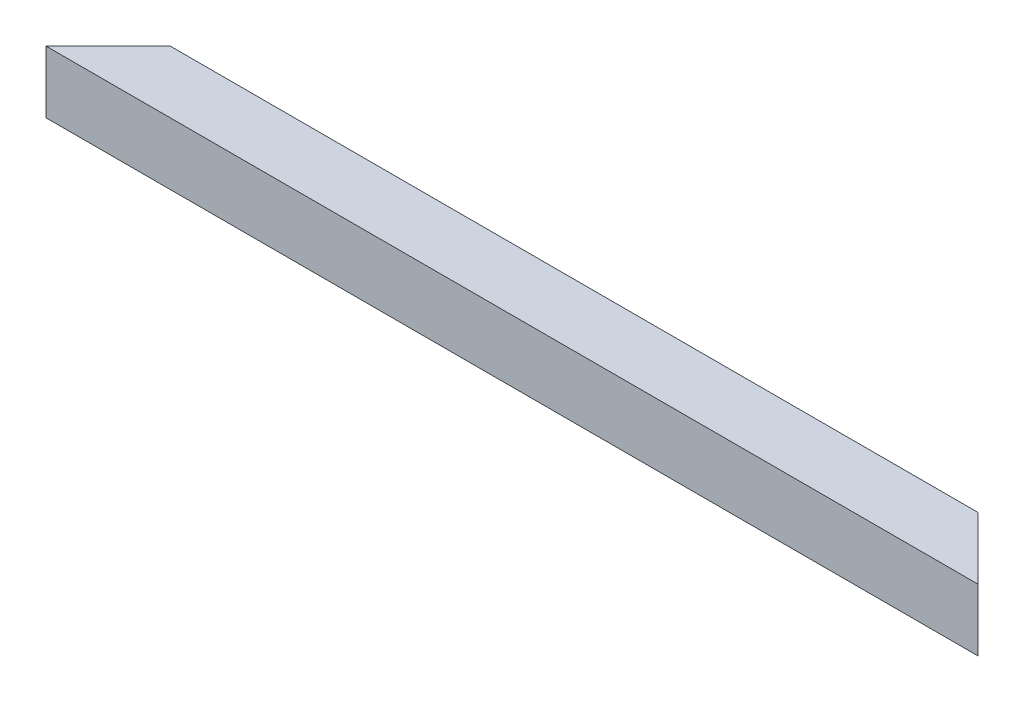
ISO-10303-21;
HEADER;
FILE_DESCRIPTION(('STEP AP214'),'2;1');
FILE_NAME('part.step','',(''),(''),'','','');
FILE_SCHEMA(('AUTOMOTIVE_DESIGN { 1 0 10303 214 1 1 1 1 }'));
ENDSEC;
DATA;
#1=APPLICATION_CONTEXT('core data for automotive mechanical design processes');
#2=APPLICATION_PROTOCOL_DEFINITION('international standard','automotive_design',2000,#1);
#3=PRODUCT_CONTEXT('',#1,'mechanical');
#4=PRODUCT('Part','Part','',(#3));
#5=PRODUCT_RELATED_PRODUCT_CATEGORY('part','',(#4));
#6=PRODUCT_DEFINITION_FORMATION('','',#4);
#7=PRODUCT_DEFINITION_CONTEXT('part definition',#1,'design');
#8=PRODUCT_DEFINITION('design','',#6,#7);
#9=PRODUCT_DEFINITION_SHAPE('','',#8);
#10=(LENGTH_UNIT() NAMED_UNIT(*) SI_UNIT(.MILLI.,.METRE.));
#11=(NAMED_UNIT(*) PLANE_ANGLE_UNIT() SI_UNIT($,.RADIAN.));
#12=(NAMED_UNIT(*) SI_UNIT($,.STERADIAN.) SOLID_ANGLE_UNIT());
#13=UNCERTAINTY_MEASURE_WITH_UNIT(LENGTH_MEASURE(1.E-05),#10,'distance_accuracy_value','');
#14=(GEOMETRIC_REPRESENTATION_CONTEXT(3) GLOBAL_UNCERTAINTY_ASSIGNED_CONTEXT((#13)) GLOBAL_UNIT_ASSIGNED_CONTEXT((#10,
#11,#12)) REPRESENTATION_CONTEXT('',''));
#15=CARTESIAN_POINT('',(0.,0.,0.));
#16=DIRECTION('',(0.,0.,1.));
#17=DIRECTION('',(1.,0.,0.));
#18=AXIS2_PLACEMENT_3D('',#15,#16,#17);
#19=CARTESIAN_POINT('',(-379.271171750864,40.,217.712147736125));
#20=DIRECTION('',(0.,0.,-1.));
#21=DIRECTION('',(-1.,0.,0.));
#22=AXIS2_PLACEMENT_3D('',#19,#20,#21);
#23=PLANE('',#22);
#24=DIRECTION('',(1.,0.,0.));
#25=VECTOR('',#24,1.);
#26=CARTESIAN_POINT('',(-379.271171750864,0.,217.712147736125));
#27=LINE('',#26,#25);
#28=CARTESIAN_POINT('',(-379.271171750864,0.,217.712147736125));
#29=VERTEX_POINT('',#28);
#30=CARTESIAN_POINT('',(220.728828249136,0.,217.712147736125));
#31=VERTEX_POINT('',#30);
#32=EDGE_CURVE('E96',#29,#31,#27,.T.);
#33=ORIENTED_EDGE('',*,*,#32,.T.);
#34=DIRECTION('',(0.,-1.,0.));
#35=VECTOR('',#34,1.);
#36=CARTESIAN_POINT('',(220.728828249136,40.,217.712147736125));
#37=LINE('',#36,#35);
#38=CARTESIAN_POINT('',(220.728828249136,40.,217.712147736125));
#39=VERTEX_POINT('',#38);
#40=EDGE_CURVE('E11',#39,#31,#37,.T.);
#41=ORIENTED_EDGE('',*,*,#40,.F.);
#42=DIRECTION('',(1.,0.,0.));
#43=VECTOR('',#42,1.);
#44=CARTESIAN_POINT('',(-379.271171750864,40.,217.712147736125));
#45=LINE('',#44,#43);
#46=CARTESIAN_POINT('',(-379.271171750864,40.,217.712147736125));
#47=VERTEX_POINT('',#46);
#48=EDGE_CURVE('E84',#47,#39,#45,.T.);
#49=ORIENTED_EDGE('',*,*,#48,.F.);
#50=DIRECTION('',(0.,-1.,0.));
#51=VECTOR('',#50,1.);
#52=CARTESIAN_POINT('',(-379.271171750864,40.,217.712147736125));
#53=LINE('',#52,#51);
#54=EDGE_CURVE('E92',#47,#29,#53,.T.);
#55=ORIENTED_EDGE('',*,*,#54,.T.);
#56=EDGE_LOOP('',(#33,#41,#49,#55));
#57=FACE_BOUND('',#56,.T.);
#58=ADVANCED_FACE('F33',(#57),#23,.F.);
#59=CARTESIAN_POINT('',(220.728828249136,40.,217.712147736125));
#60=DIRECTION('',(-0.707106781186544,0.,0.707106781186551));
#61=DIRECTION('',(0.707106781186551,0.,0.707106781186544));
#62=AXIS2_PLACEMENT_3D('',#59,#60,#61);
#63=PLANE('',#62);
#64=DIRECTION('',(-0.707106781186551,0.,-0.707106781186543));
#65=VECTOR('',#64,1.);
#66=CARTESIAN_POINT('',(220.728828249136,0.,217.712147736125));
#67=LINE('',#66,#65);
#68=CARTESIAN_POINT('',(180.728828249135,0.,177.712147736125));
#69=VERTEX_POINT('',#68);
#70=EDGE_CURVE('E88',#31,#69,#67,.T.);
#71=ORIENTED_EDGE('',*,*,#70,.T.);
#72=DIRECTION('',(0.,-1.,0.));
#73=VECTOR('',#72,1.);
#74=CARTESIAN_POINT('',(180.728828249135,40.,177.712147736125));
#75=LINE('',#74,#73);
#76=CARTESIAN_POINT('',(180.728828249135,40.,177.712147736125));
#77=VERTEX_POINT('',#76);
#78=EDGE_CURVE('E41',#77,#69,#75,.T.);
#79=ORIENTED_EDGE('',*,*,#78,.F.);
#80=DIRECTION('',(-0.707106781186551,0.,-0.707106781186543));
#81=VECTOR('',#80,1.);
#82=CARTESIAN_POINT('',(220.728828249136,40.,217.712147736125));
#83=LINE('',#82,#81);
#84=EDGE_CURVE('E79',#39,#77,#83,.T.);
#85=ORIENTED_EDGE('',*,*,#84,.F.);
#86=ORIENTED_EDGE('',*,*,#40,.T.);
#87=EDGE_LOOP('',(#71,#79,#85,#86));
#88=FACE_BOUND('',#87,.T.);
#89=ADVANCED_FACE('F87',(#88),#63,.F.);
#90=CARTESIAN_POINT('',(-339.271171750864,40.,177.712147736125));
#91=DIRECTION('',(0.,0.,1.));
#92=DIRECTION('',(1.,0.,0.));
#93=AXIS2_PLACEMENT_3D('',#90,#91,#92);
#94=PLANE('',#93);
#95=DIRECTION('',(-1.,0.,0.));
#96=VECTOR('',#95,1.);
#97=CARTESIAN_POINT('',(-339.271171750864,0.,177.712147736125));
#98=LINE('',#97,#96);
#99=CARTESIAN_POINT('',(-339.271171750864,0.,177.712147736125));
#100=VERTEX_POINT('',#99);
#101=EDGE_CURVE('E66',#69,#100,#98,.T.);
#102=ORIENTED_EDGE('',*,*,#101,.T.);
#103=DIRECTION('',(0.,-1.,0.));
#104=VECTOR('',#103,1.);
#105=CARTESIAN_POINT('',(-339.271171750864,40.,177.712147736125));
#106=LINE('',#105,#104);
#107=CARTESIAN_POINT('',(-339.271171750864,40.,177.712147736125));
#108=VERTEX_POINT('',#107);
#109=EDGE_CURVE('E89',#108,#100,#106,.T.);
#110=ORIENTED_EDGE('',*,*,#109,.F.);
#111=DIRECTION('',(-1.,0.,0.));
#112=VECTOR('',#111,1.);
#113=CARTESIAN_POINT('',(-339.271171750864,40.,177.712147736125));
#114=LINE('',#113,#112);
#115=EDGE_CURVE('E82',#77,#108,#114,.T.);
#116=ORIENTED_EDGE('',*,*,#115,.F.);
#117=ORIENTED_EDGE('',*,*,#78,.T.);
#118=EDGE_LOOP('',(#102,#110,#116,#117));
#119=FACE_BOUND('',#118,.T.);
#120=ADVANCED_FACE('F90',(#119),#94,.F.);
#121=CARTESIAN_POINT('',(-379.271171750864,40.,217.712147736125));
#122=DIRECTION('',(0.707106781186549,0.,0.707106781186546));
#123=DIRECTION('',(0.707106781186546,0.,-0.707106781186549));
#124=AXIS2_PLACEMENT_3D('',#121,#122,#123);
#125=PLANE('',#124);
#126=DIRECTION('',(-0.707106781186546,0.,0.707106781186549));
#127=VECTOR('',#126,1.);
#128=CARTESIAN_POINT('',(-379.271171750864,0.,217.712147736125));
#129=LINE('',#128,#127);
#130=EDGE_CURVE('E72',#100,#29,#129,.T.);
#131=ORIENTED_EDGE('',*,*,#130,.T.);
#132=ORIENTED_EDGE('',*,*,#54,.F.);
#133=DIRECTION('',(-0.707106781186546,0.,0.707106781186549));
#134=VECTOR('',#133,1.);
#135=CARTESIAN_POINT('',(-379.271171750864,40.,217.712147736125));
#136=LINE('',#135,#134);
#137=EDGE_CURVE('E49',#108,#47,#136,.T.);
#138=ORIENTED_EDGE('',*,*,#137,.F.);
#139=ORIENTED_EDGE('',*,*,#109,.T.);
#140=EDGE_LOOP('',(#131,#132,#138,#139));
#141=FACE_BOUND('',#140,.T.);
#142=ADVANCED_FACE('F103',(#141),#125,.F.);
#143=CARTESIAN_POINT('',(0.,40.,0.));
#144=DIRECTION('',(0.,1.,0.));
#145=DIRECTION('',(0.,0.,1.));
#146=AXIS2_PLACEMENT_3D('',#143,#144,#145);
#147=PLANE('',#146);
#148=ORIENTED_EDGE('',*,*,#48,.T.);
#149=ORIENTED_EDGE('',*,*,#84,.T.);
#150=ORIENTED_EDGE('',*,*,#115,.T.);
#151=ORIENTED_EDGE('',*,*,#137,.T.);
#152=EDGE_LOOP('',(#148,#149,#150,#151));
#153=FACE_BOUND('',#152,.T.);
#154=ADVANCED_FACE('F80',(#153),#147,.T.);
#155=CARTESIAN_POINT('',(0.,0.,0.));
#156=DIRECTION('',(0.,1.,0.));
#157=DIRECTION('',(0.,0.,1.));
#158=AXIS2_PLACEMENT_3D('',#155,#156,#157);
#159=PLANE('',#158);
#160=ORIENTED_EDGE('',*,*,#32,.F.);
#161=ORIENTED_EDGE('',*,*,#130,.F.);
#162=ORIENTED_EDGE('',*,*,#101,.F.);
#163=ORIENTED_EDGE('',*,*,#70,.F.);
#164=EDGE_LOOP('',(#160,#161,#162,#163));
#165=FACE_BOUND('',#164,.T.);
#166=ADVANCED_FACE('F106',(#165),#159,.F.);
#167=CLOSED_SHELL('',(#58,#89,#120,#142,#154,#166));
#168=MANIFOLD_SOLID_BREP('B2',#167);
#169=ADVANCED_BREP_SHAPE_REPRESENTATION('',(#18,#168),#14);
#170=SHAPE_DEFINITION_REPRESENTATION(#9,#169);
ENDSEC;
END-ISO-10303-21;
